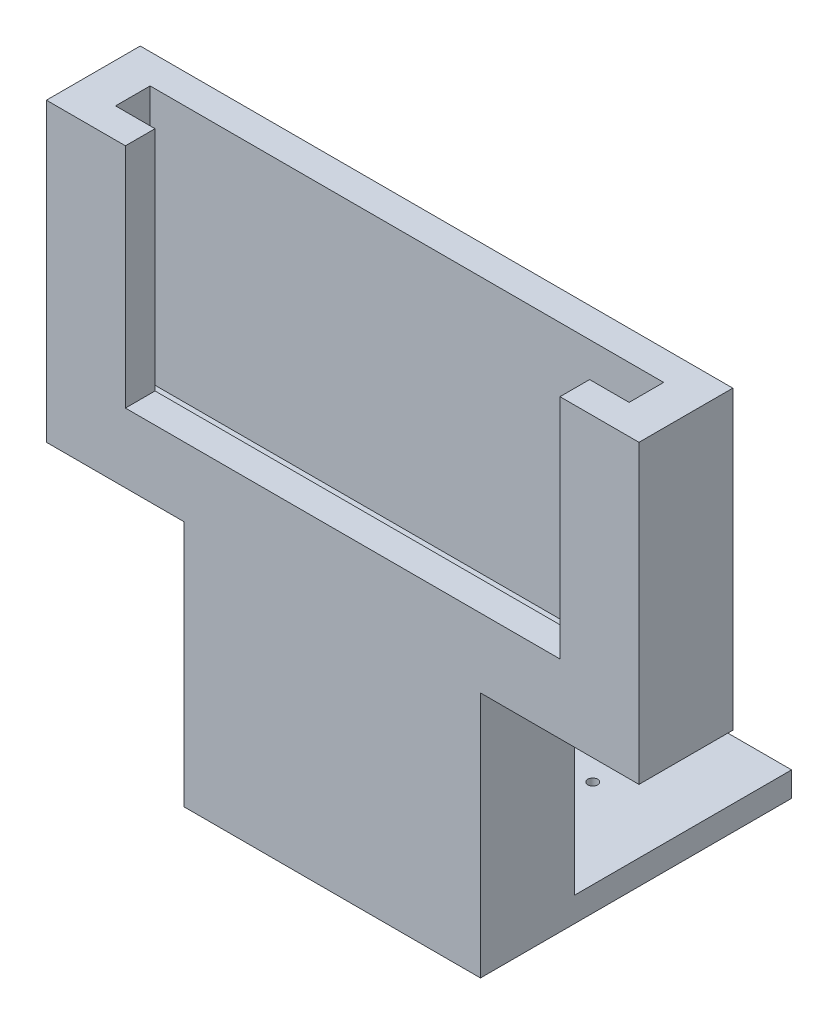
ISO-10303-21;
HEADER;
FILE_DESCRIPTION(('STEP AP214'),'2;1');
FILE_NAME('part.step','',(''),(''),'','','');
FILE_SCHEMA(('AUTOMOTIVE_DESIGN { 1 0 10303 214 1 1 1 1 }'));
ENDSEC;
DATA;
#1=APPLICATION_CONTEXT('core data for automotive mechanical design processes');
#2=APPLICATION_PROTOCOL_DEFINITION('international standard','automotive_design',2000,#1);
#3=PRODUCT_CONTEXT('',#1,'mechanical');
#4=PRODUCT('Part','Part','',(#3));
#5=PRODUCT_RELATED_PRODUCT_CATEGORY('part','',(#4));
#6=PRODUCT_DEFINITION_FORMATION('','',#4);
#7=PRODUCT_DEFINITION_CONTEXT('part definition',#1,'design');
#8=PRODUCT_DEFINITION('design','',#6,#7);
#9=PRODUCT_DEFINITION_SHAPE('','',#8);
#10=(LENGTH_UNIT() NAMED_UNIT(*) SI_UNIT(.MILLI.,.METRE.));
#11=(NAMED_UNIT(*) PLANE_ANGLE_UNIT() SI_UNIT($,.RADIAN.));
#12=(NAMED_UNIT(*) SI_UNIT($,.STERADIAN.) SOLID_ANGLE_UNIT());
#13=UNCERTAINTY_MEASURE_WITH_UNIT(LENGTH_MEASURE(1.E-05),#10,'distance_accuracy_value','');
#14=(GEOMETRIC_REPRESENTATION_CONTEXT(3) GLOBAL_UNCERTAINTY_ASSIGNED_CONTEXT((#13)) GLOBAL_UNIT_ASSIGNED_CONTEXT((#10,
#11,#12)) REPRESENTATION_CONTEXT('',''));
#15=CARTESIAN_POINT('',(0.,0.,0.));
#16=DIRECTION('',(0.,0.,1.));
#17=DIRECTION('',(1.,0.,0.));
#18=AXIS2_PLACEMENT_3D('',#15,#16,#17);
#19=CARTESIAN_POINT('',(0.,0.,0.));
#20=DIRECTION('',(0.,0.,1.));
#21=DIRECTION('',(1.,0.,0.));
#22=AXIS2_PLACEMENT_3D('',#19,#20,#21);
#23=PLANE('',#22);
#24=DIRECTION('',(1.,0.,0.));
#25=VECTOR('',#24,1.);
#26=CARTESIAN_POINT('',(13.951048951049,-37.5,0.));
#27=LINE('',#26,#25);
#28=CARTESIAN_POINT('',(-16.048951048951,-37.5,0.));
#29=VERTEX_POINT('',#28);
#30=CARTESIAN_POINT('',(13.951048951049,-37.5,0.));
#31=VERTEX_POINT('',#30);
#32=EDGE_CURVE('E178',#29,#31,#27,.T.);
#33=ORIENTED_EDGE('',*,*,#32,.F.);
#34=DIRECTION('',(0.,1.,0.));
#35=VECTOR('',#34,1.);
#36=CARTESIAN_POINT('',(-16.048951048951,0.,0.));
#37=LINE('',#36,#35);
#38=CARTESIAN_POINT('',(-16.048951048951,-15.,0.));
#39=VERTEX_POINT('',#38);
#40=EDGE_CURVE('E416',#29,#39,#37,.T.);
#41=ORIENTED_EDGE('',*,*,#40,.T.);
#42=DIRECTION('',(-1.,0.,0.));
#43=VECTOR('',#42,1.);
#44=CARTESIAN_POINT('',(0.,-15.,0.));
#45=LINE('',#44,#43);
#46=CARTESIAN_POINT('',(-30.,-15.,0.));
#47=VERTEX_POINT('',#46);
#48=EDGE_CURVE('E413',#39,#47,#45,.T.);
#49=ORIENTED_EDGE('',*,*,#48,.T.);
#50=DIRECTION('',(0.,1.,0.));
#51=VECTOR('',#50,1.);
#52=CARTESIAN_POINT('',(-30.,0.,0.));
#53=LINE('',#52,#51);
#54=CARTESIAN_POINT('',(-30.,15.,0.));
#55=VERTEX_POINT('',#54);
#56=EDGE_CURVE('E398',#47,#55,#53,.T.);
#57=ORIENTED_EDGE('',*,*,#56,.T.);
#58=DIRECTION('',(-1.,0.,0.));
#59=VECTOR('',#58,1.);
#60=CARTESIAN_POINT('',(0.,15.,0.));
#61=LINE('',#60,#59);
#62=CARTESIAN_POINT('',(30.,15.,0.));
#63=VERTEX_POINT('',#62);
#64=EDGE_CURVE('E410',#63,#55,#61,.T.);
#65=ORIENTED_EDGE('',*,*,#64,.F.);
#66=DIRECTION('',(0.,1.,0.));
#67=VECTOR('',#66,1.);
#68=CARTESIAN_POINT('',(30.,0.,0.));
#69=LINE('',#68,#67);
#70=CARTESIAN_POINT('',(30.,-15.,0.));
#71=VERTEX_POINT('',#70);
#72=EDGE_CURVE('E421',#71,#63,#69,.T.);
#73=ORIENTED_EDGE('',*,*,#72,.F.);
#74=CARTESIAN_POINT('',(13.951048951049,-15.,0.));
#75=VERTEX_POINT('',#74);
#76=EDGE_CURVE('E417',#71,#75,#45,.T.);
#77=ORIENTED_EDGE('',*,*,#76,.T.);
#78=DIRECTION('',(0.,1.,0.));
#79=VECTOR('',#78,1.);
#80=CARTESIAN_POINT('',(13.951048951049,0.,0.));
#81=LINE('',#80,#79);
#82=EDGE_CURVE('E419',#31,#75,#81,.T.);
#83=ORIENTED_EDGE('',*,*,#82,.F.);
#84=EDGE_LOOP('',(#33,#41,#49,#57,#65,#73,#77,#83));
#85=FACE_BOUND('',#84,.T.);
#86=ADVANCED_FACE('F161',(#85),#23,.F.);
#87=CARTESIAN_POINT('',(0.,0.,3.));
#88=DIRECTION('',(0.,0.,1.));
#89=DIRECTION('',(1.,0.,0.));
#90=AXIS2_PLACEMENT_3D('',#87,#88,#89);
#91=PLANE('',#90);
#92=DIRECTION('',(-1.,0.,0.));
#93=VECTOR('',#92,1.);
#94=CARTESIAN_POINT('',(0.,15.,3.));
#95=LINE('',#94,#93);
#96=CARTESIAN_POINT('',(26.,15.,3.));
#97=VERTEX_POINT('',#96);
#98=CARTESIAN_POINT('',(-26.,15.,3.));
#99=VERTEX_POINT('',#98);
#100=EDGE_CURVE('E407',#97,#99,#95,.T.);
#101=ORIENTED_EDGE('',*,*,#100,.T.);
#102=DIRECTION('',(0.,-1.,0.));
#103=VECTOR('',#102,1.);
#104=CARTESIAN_POINT('',(-26.,15.,3.));
#105=LINE('',#104,#103);
#106=CARTESIAN_POINT('',(-26.,-11.,3.));
#107=VERTEX_POINT('',#106);
#108=EDGE_CURVE('E186',#99,#107,#105,.T.);
#109=ORIENTED_EDGE('',*,*,#108,.T.);
#110=DIRECTION('',(1.,0.,0.));
#111=VECTOR('',#110,1.);
#112=CARTESIAN_POINT('',(-26.,-11.,3.));
#113=LINE('',#112,#111);
#114=CARTESIAN_POINT('',(26.,-11.,3.));
#115=VERTEX_POINT('',#114);
#116=EDGE_CURVE('E394',#107,#115,#113,.T.);
#117=ORIENTED_EDGE('',*,*,#116,.T.);
#118=DIRECTION('',(0.,-1.,0.));
#119=VECTOR('',#118,1.);
#120=CARTESIAN_POINT('',(26.,15.,3.));
#121=LINE('',#120,#119);
#122=EDGE_CURVE('E360',#97,#115,#121,.T.);
#123=ORIENTED_EDGE('',*,*,#122,.F.);
#124=EDGE_LOOP('',(#101,#109,#117,#123));
#125=FACE_BOUND('',#124,.T.);
#126=ADVANCED_FACE('F485',(#125),#91,.T.);
#127=CARTESIAN_POINT('',(-30.,0.,3.));
#128=DIRECTION('',(-1.,0.,0.));
#129=DIRECTION('',(0.,0.,1.));
#130=AXIS2_PLACEMENT_3D('',#127,#128,#129);
#131=PLANE('',#130);
#132=ORIENTED_EDGE('',*,*,#56,.F.);
#133=DIRECTION('',(0.,0.,-1.));
#134=VECTOR('',#133,1.);
#135=CARTESIAN_POINT('',(-30.,-15.,3.));
#136=LINE('',#135,#134);
#137=CARTESIAN_POINT('',(-30.,-15.,9.5));
#138=VERTEX_POINT('',#137);
#139=EDGE_CURVE('E12',#138,#47,#136,.T.);
#140=ORIENTED_EDGE('',*,*,#139,.F.);
#141=DIRECTION('',(0.,-1.,0.));
#142=VECTOR('',#141,1.);
#143=CARTESIAN_POINT('',(-30.,15.,9.5));
#144=LINE('',#143,#142);
#145=CARTESIAN_POINT('',(-30.,15.,9.5));
#146=VERTEX_POINT('',#145);
#147=EDGE_CURVE('E337',#146,#138,#144,.T.);
#148=ORIENTED_EDGE('',*,*,#147,.F.);
#149=DIRECTION('',(0.,0.,-1.));
#150=VECTOR('',#149,1.);
#151=CARTESIAN_POINT('',(-30.,15.,3.));
#152=LINE('',#151,#150);
#153=EDGE_CURVE('E409',#146,#55,#152,.T.);
#154=ORIENTED_EDGE('',*,*,#153,.T.);
#155=EDGE_LOOP('',(#132,#140,#148,#154));
#156=FACE_BOUND('',#155,.T.);
#157=ADVANCED_FACE('F163',(#156),#131,.T.);
#158=CARTESIAN_POINT('',(0.,-15.,3.));
#159=DIRECTION('',(0.,-1.,0.));
#160=DIRECTION('',(1.,0.,0.));
#161=AXIS2_PLACEMENT_3D('',#158,#159,#160);
#162=PLANE('',#161);
#163=ORIENTED_EDGE('',*,*,#48,.F.);
#164=DIRECTION('',(0.,0.,-1.));
#165=VECTOR('',#164,1.);
#166=CARTESIAN_POINT('',(-16.048951048951,-15.,3.));
#167=LINE('',#166,#165);
#168=CARTESIAN_POINT('',(-16.048951048951,-15.,9.5));
#169=VERTEX_POINT('',#168);
#170=EDGE_CURVE('E170',#169,#39,#167,.T.);
#171=ORIENTED_EDGE('',*,*,#170,.F.);
#172=DIRECTION('',(1.,0.,0.));
#173=VECTOR('',#172,1.);
#174=CARTESIAN_POINT('',(-30.,-15.,9.5));
#175=LINE('',#174,#173);
#176=EDGE_CURVE('E327',#138,#169,#175,.T.);
#177=ORIENTED_EDGE('',*,*,#176,.F.);
#178=ORIENTED_EDGE('',*,*,#139,.T.);
#179=EDGE_LOOP('',(#163,#171,#177,#178));
#180=FACE_BOUND('',#179,.T.);
#181=ADVANCED_FACE('F480',(#180),#162,.T.);
#182=CARTESIAN_POINT('',(-16.048951048951,0.,3.));
#183=DIRECTION('',(-1.,0.,0.));
#184=DIRECTION('',(0.,0.,1.));
#185=AXIS2_PLACEMENT_3D('',#182,#183,#184);
#186=PLANE('',#185);
#187=ORIENTED_EDGE('',*,*,#40,.F.);
#188=DIRECTION('',(0.,0.,1.));
#189=VECTOR('',#188,1.);
#190=CARTESIAN_POINT('',(-16.048951048951,-37.5,-22.));
#191=LINE('',#190,#189);
#192=CARTESIAN_POINT('',(-16.048951048951,-37.5,-22.));
#193=VERTEX_POINT('',#192);
#194=EDGE_CURVE('E323',#193,#29,#191,.T.);
#195=ORIENTED_EDGE('',*,*,#194,.F.);
#196=DIRECTION('',(0.,1.,0.));
#197=VECTOR('',#196,1.);
#198=CARTESIAN_POINT('',(-16.048951048951,-40.,-22.));
#199=LINE('',#198,#197);
#200=CARTESIAN_POINT('',(-16.048951048951,-40.,-22.));
#201=VERTEX_POINT('',#200);
#202=EDGE_CURVE('E306',#201,#193,#199,.T.);
#203=ORIENTED_EDGE('',*,*,#202,.F.);
#204=DIRECTION('',(0.,0.,-1.));
#205=VECTOR('',#204,1.);
#206=CARTESIAN_POINT('',(-16.048951048951,-40.,3.));
#207=LINE('',#206,#205);
#208=CARTESIAN_POINT('',(-16.048951048951,-40.,9.5));
#209=VERTEX_POINT('',#208);
#210=EDGE_CURVE('E298',#209,#201,#207,.T.);
#211=ORIENTED_EDGE('',*,*,#210,.F.);
#212=DIRECTION('',(0.,-1.,0.));
#213=VECTOR('',#212,1.);
#214=CARTESIAN_POINT('',(-16.048951048951,-15.,9.5));
#215=LINE('',#214,#213);
#216=EDGE_CURVE('E373',#169,#209,#215,.T.);
#217=ORIENTED_EDGE('',*,*,#216,.F.);
#218=ORIENTED_EDGE('',*,*,#170,.T.);
#219=EDGE_LOOP('',(#187,#195,#203,#211,#217,#218));
#220=FACE_BOUND('',#219,.T.);
#221=ADVANCED_FACE('F469',(#220),#186,.T.);
#222=CARTESIAN_POINT('',(0.,-40.,3.));
#223=DIRECTION('',(0.,-1.,0.));
#224=DIRECTION('',(1.,0.,0.));
#225=AXIS2_PLACEMENT_3D('',#222,#223,#224);
#226=PLANE('',#225);
#227=CARTESIAN_POINT('',(-1.04895104895104,-40.,-4.86835964971758));
#228=DIRECTION('',(0.,-1.,0.));
#229=DIRECTION('',(1.,0.,0.));
#230=AXIS2_PLACEMENT_3D('',#227,#228,#229);
#231=CIRCLE('',#230,0.5);
#232=CARTESIAN_POINT('',(-0.54895104895104,-40.,-4.86835964971758));
#233=VERTEX_POINT('',#232);
#234=EDGE_CURVE('E444',#233,#233,#231,.T.);
#235=ORIENTED_EDGE('',*,*,#234,.F.);
#236=EDGE_LOOP('',(#235));
#237=FACE_BOUND('',#236,.T.);
#238=CARTESIAN_POINT('',(-1.04895104895104,-40.,-16.8683596497176));
#239=DIRECTION('',(0.,-1.,0.));
#240=DIRECTION('',(1.,0.,0.));
#241=AXIS2_PLACEMENT_3D('',#238,#239,#240);
#242=CIRCLE('',#241,0.5);
#243=CARTESIAN_POINT('',(-0.548951048951039,-40.,-16.8683596497176));
#244=VERTEX_POINT('',#243);
#245=EDGE_CURVE('E708',#244,#244,#242,.T.);
#246=ORIENTED_EDGE('',*,*,#245,.F.);
#247=EDGE_LOOP('',(#246));
#248=FACE_BOUND('',#247,.T.);
#249=CARTESIAN_POINT('',(4.95104895104896,-40.,-10.8683596497176));
#250=DIRECTION('',(0.,-1.,0.));
#251=DIRECTION('',(1.,0.,0.));
#252=AXIS2_PLACEMENT_3D('',#249,#250,#251);
#253=CIRCLE('',#252,0.500000000000001);
#254=CARTESIAN_POINT('',(5.45104895104896,-40.,-10.8683596497176));
#255=VERTEX_POINT('',#254);
#256=EDGE_CURVE('E711',#255,#255,#253,.T.);
#257=ORIENTED_EDGE('',*,*,#256,.F.);
#258=EDGE_LOOP('',(#257));
#259=FACE_BOUND('',#258,.T.);
#260=CARTESIAN_POINT('',(-7.04895104895104,-40.,-10.8683596497176));
#261=DIRECTION('',(0.,-1.,0.));
#262=DIRECTION('',(1.,0.,0.));
#263=AXIS2_PLACEMENT_3D('',#260,#261,#262);
#264=CIRCLE('',#263,0.500000000000001);
#265=CARTESIAN_POINT('',(-6.54895104895104,-40.,-10.8683596497176));
#266=VERTEX_POINT('',#265);
#267=EDGE_CURVE('E458',#266,#266,#264,.T.);
#268=ORIENTED_EDGE('',*,*,#267,.F.);
#269=EDGE_LOOP('',(#268));
#270=FACE_BOUND('',#269,.T.);
#271=CARTESIAN_POINT('',(-1.04895104895104,-40.,-10.8683596497176));
#272=DIRECTION('',(0.,-1.,0.));
#273=DIRECTION('',(1.,0.,0.));
#274=AXIS2_PLACEMENT_3D('',#271,#272,#273);
#275=CIRCLE('',#274,3.);
#276=CARTESIAN_POINT('',(1.95104895104896,-40.,-10.8683596497176));
#277=VERTEX_POINT('',#276);
#278=EDGE_CURVE('E316',#277,#277,#275,.T.);
#279=ORIENTED_EDGE('',*,*,#278,.F.);
#280=EDGE_LOOP('',(#279));
#281=FACE_BOUND('',#280,.T.);
#282=ORIENTED_EDGE('',*,*,#210,.T.);
#283=DIRECTION('',(-1.,0.,0.));
#284=VECTOR('',#283,1.);
#285=CARTESIAN_POINT('',(13.951048951049,-40.,-22.));
#286=LINE('',#285,#284);
#287=CARTESIAN_POINT('',(13.951048951049,-40.,-22.));
#288=VERTEX_POINT('',#287);
#289=EDGE_CURVE('E302',#288,#201,#286,.T.);
#290=ORIENTED_EDGE('',*,*,#289,.F.);
#291=DIRECTION('',(0.,0.,-1.));
#292=VECTOR('',#291,1.);
#293=CARTESIAN_POINT('',(13.951048951049,-40.,3.));
#294=LINE('',#293,#292);
#295=CARTESIAN_POINT('',(13.951048951049,-40.,9.5));
#296=VERTEX_POINT('',#295);
#297=EDGE_CURVE('E287',#296,#288,#294,.T.);
#298=ORIENTED_EDGE('',*,*,#297,.F.);
#299=DIRECTION('',(1.,0.,0.));
#300=VECTOR('',#299,1.);
#301=CARTESIAN_POINT('',(-16.048951048951,-40.,9.5));
#302=LINE('',#301,#300);
#303=EDGE_CURVE('E326',#209,#296,#302,.T.);
#304=ORIENTED_EDGE('',*,*,#303,.F.);
#305=EDGE_LOOP('',(#282,#290,#298,#304));
#306=FACE_BOUND('',#305,.T.);
#307=ADVANCED_FACE('F303',(#237,#248,#259,#270,#281,#306),#226,.T.);
#308=CARTESIAN_POINT('',(13.951048951049,0.,3.));
#309=DIRECTION('',(-1.,0.,0.));
#310=DIRECTION('',(0.,-1.,0.));
#311=AXIS2_PLACEMENT_3D('',#308,#309,#310);
#312=PLANE('',#311);
#313=ORIENTED_EDGE('',*,*,#297,.T.);
#314=DIRECTION('',(0.,-1.,0.));
#315=VECTOR('',#314,1.);
#316=CARTESIAN_POINT('',(13.951048951049,-40.,-22.));
#317=LINE('',#316,#315);
#318=CARTESIAN_POINT('',(13.951048951049,-37.5,-22.));
#319=VERTEX_POINT('',#318);
#320=EDGE_CURVE('E292',#319,#288,#317,.T.);
#321=ORIENTED_EDGE('',*,*,#320,.F.);
#322=DIRECTION('',(0.,0.,1.));
#323=VECTOR('',#322,1.);
#324=CARTESIAN_POINT('',(13.951048951049,-37.5,-22.));
#325=LINE('',#324,#323);
#326=EDGE_CURVE('E320',#319,#31,#325,.T.);
#327=ORIENTED_EDGE('',*,*,#326,.T.);
#328=ORIENTED_EDGE('',*,*,#82,.T.);
#329=DIRECTION('',(0.,0.,-1.));
#330=VECTOR('',#329,1.);
#331=CARTESIAN_POINT('',(13.951048951049,-15.,3.));
#332=LINE('',#331,#330);
#333=CARTESIAN_POINT('',(13.951048951049,-15.,9.5));
#334=VERTEX_POINT('',#333);
#335=EDGE_CURVE('E299',#334,#75,#332,.T.);
#336=ORIENTED_EDGE('',*,*,#335,.F.);
#337=DIRECTION('',(0.,-1.,0.));
#338=VECTOR('',#337,1.);
#339=CARTESIAN_POINT('',(13.951048951049,-15.,9.5));
#340=LINE('',#339,#338);
#341=EDGE_CURVE('E294',#334,#296,#340,.T.);
#342=ORIENTED_EDGE('',*,*,#341,.T.);
#343=EDGE_LOOP('',(#313,#321,#327,#328,#336,#342));
#344=FACE_BOUND('',#343,.T.);
#345=ADVANCED_FACE('F289',(#344),#312,.F.);
#346=ORIENTED_EDGE('',*,*,#76,.F.);
#347=DIRECTION('',(0.,0.,-1.));
#348=VECTOR('',#347,1.);
#349=CARTESIAN_POINT('',(30.,-15.,3.));
#350=LINE('',#349,#348);
#351=CARTESIAN_POINT('',(30.,-15.,9.5));
#352=VERTEX_POINT('',#351);
#353=EDGE_CURVE('E429',#352,#71,#350,.T.);
#354=ORIENTED_EDGE('',*,*,#353,.F.);
#355=DIRECTION('',(1.,0.,0.));
#356=VECTOR('',#355,1.);
#357=CARTESIAN_POINT('',(-22.,-15.,9.5));
#358=LINE('',#357,#356);
#359=EDGE_CURVE('E352',#334,#352,#358,.T.);
#360=ORIENTED_EDGE('',*,*,#359,.F.);
#361=ORIENTED_EDGE('',*,*,#335,.T.);
#362=EDGE_LOOP('',(#346,#354,#360,#361));
#363=FACE_BOUND('',#362,.T.);
#364=ADVANCED_FACE('F477',(#363),#162,.T.);
#365=CARTESIAN_POINT('',(30.,0.,3.));
#366=DIRECTION('',(-1.,0.,0.));
#367=DIRECTION('',(0.,0.,1.));
#368=AXIS2_PLACEMENT_3D('',#365,#366,#367);
#369=PLANE('',#368);
#370=ORIENTED_EDGE('',*,*,#72,.T.);
#371=DIRECTION('',(0.,0.,-1.));
#372=VECTOR('',#371,1.);
#373=CARTESIAN_POINT('',(30.,15.,3.));
#374=LINE('',#373,#372);
#375=CARTESIAN_POINT('',(30.,15.,9.5));
#376=VERTEX_POINT('',#375);
#377=EDGE_CURVE('E426',#376,#63,#374,.T.);
#378=ORIENTED_EDGE('',*,*,#377,.F.);
#379=DIRECTION('',(0.,1.,0.));
#380=VECTOR('',#379,1.);
#381=CARTESIAN_POINT('',(30.,-15.,9.5));
#382=LINE('',#381,#380);
#383=EDGE_CURVE('E368',#352,#376,#382,.T.);
#384=ORIENTED_EDGE('',*,*,#383,.F.);
#385=ORIENTED_EDGE('',*,*,#353,.T.);
#386=EDGE_LOOP('',(#370,#378,#384,#385));
#387=FACE_BOUND('',#386,.T.);
#388=ADVANCED_FACE('F498',(#387),#369,.F.);
#389=CARTESIAN_POINT('',(0.,15.,3.));
#390=DIRECTION('',(0.,-1.,0.));
#391=DIRECTION('',(1.,0.,0.));
#392=AXIS2_PLACEMENT_3D('',#389,#390,#391);
#393=PLANE('',#392);
#394=ORIENTED_EDGE('',*,*,#64,.T.);
#395=ORIENTED_EDGE('',*,*,#153,.F.);
#396=DIRECTION('',(1.,0.,0.));
#397=VECTOR('',#396,1.);
#398=CARTESIAN_POINT('',(-30.,15.,9.5));
#399=LINE('',#398,#397);
#400=CARTESIAN_POINT('',(-22.,15.,9.5));
#401=VERTEX_POINT('',#400);
#402=EDGE_CURVE('E334',#146,#401,#399,.T.);
#403=ORIENTED_EDGE('',*,*,#402,.T.);
#404=DIRECTION('',(0.,0.,-1.));
#405=VECTOR('',#404,1.);
#406=CARTESIAN_POINT('',(-22.,15.,9.5));
#407=LINE('',#406,#405);
#408=CARTESIAN_POINT('',(-22.,15.,6.5));
#409=VERTEX_POINT('',#408);
#410=EDGE_CURVE('E340',#401,#409,#407,.T.);
#411=ORIENTED_EDGE('',*,*,#410,.T.);
#412=DIRECTION('',(1.,0.,0.));
#413=VECTOR('',#412,1.);
#414=CARTESIAN_POINT('',(-30.,15.,6.5));
#415=LINE('',#414,#413);
#416=CARTESIAN_POINT('',(-26.,15.,6.5));
#417=VERTEX_POINT('',#416);
#418=EDGE_CURVE('E331',#417,#409,#415,.T.);
#419=ORIENTED_EDGE('',*,*,#418,.F.);
#420=DIRECTION('',(0.,0.,-1.));
#421=VECTOR('',#420,1.);
#422=CARTESIAN_POINT('',(-26.,15.,6.5));
#423=LINE('',#422,#421);
#424=EDGE_CURVE('E385',#417,#99,#423,.T.);
#425=ORIENTED_EDGE('',*,*,#424,.T.);
#426=ORIENTED_EDGE('',*,*,#100,.F.);
#427=DIRECTION('',(0.,0.,-1.));
#428=VECTOR('',#427,1.);
#429=CARTESIAN_POINT('',(26.,15.,6.5));
#430=LINE('',#429,#428);
#431=CARTESIAN_POINT('',(26.,15.,6.5));
#432=VERTEX_POINT('',#431);
#433=EDGE_CURVE('E396',#432,#97,#430,.T.);
#434=ORIENTED_EDGE('',*,*,#433,.F.);
#435=DIRECTION('',(-1.,0.,0.));
#436=VECTOR('',#435,1.);
#437=CARTESIAN_POINT('',(30.,15.,6.5));
#438=LINE('',#437,#436);
#439=CARTESIAN_POINT('',(22.,15.,6.5));
#440=VERTEX_POINT('',#439);
#441=EDGE_CURVE('E371',#432,#440,#438,.T.);
#442=ORIENTED_EDGE('',*,*,#441,.T.);
#443=DIRECTION('',(0.,0.,-1.));
#444=VECTOR('',#443,1.);
#445=CARTESIAN_POINT('',(22.,15.,9.5));
#446=LINE('',#445,#444);
#447=CARTESIAN_POINT('',(22.,15.,9.5));
#448=VERTEX_POINT('',#447);
#449=EDGE_CURVE('E358',#448,#440,#446,.T.);
#450=ORIENTED_EDGE('',*,*,#449,.F.);
#451=DIRECTION('',(-1.,0.,0.));
#452=VECTOR('',#451,1.);
#453=CARTESIAN_POINT('',(30.,15.,9.5));
#454=LINE('',#453,#452);
#455=EDGE_CURVE('E362',#376,#448,#454,.T.);
#456=ORIENTED_EDGE('',*,*,#455,.F.);
#457=ORIENTED_EDGE('',*,*,#377,.T.);
#458=EDGE_LOOP('',(#394,#395,#403,#411,#419,#425,#426,#434,#442,#450,#456,#457));
#459=FACE_BOUND('',#458,.T.);
#460=ADVANCED_FACE('F494',(#459),#393,.F.);
#461=CARTESIAN_POINT('',(-26.,15.,6.5));
#462=DIRECTION('',(1.,0.,0.));
#463=DIRECTION('',(0.,0.,-1.));
#464=AXIS2_PLACEMENT_3D('',#461,#462,#463);
#465=PLANE('',#464);
#466=DIRECTION('',(0.,-1.,0.));
#467=VECTOR('',#466,1.);
#468=CARTESIAN_POINT('',(-26.,15.,6.5));
#469=LINE('',#468,#467);
#470=CARTESIAN_POINT('',(-26.,-11.,6.5));
#471=VERTEX_POINT('',#470);
#472=EDGE_CURVE('E382',#417,#471,#469,.T.);
#473=ORIENTED_EDGE('',*,*,#472,.T.);
#474=DIRECTION('',(0.,0.,-1.));
#475=VECTOR('',#474,1.);
#476=CARTESIAN_POINT('',(-26.,-11.,6.5));
#477=LINE('',#476,#475);
#478=EDGE_CURVE('E390',#471,#107,#477,.T.);
#479=ORIENTED_EDGE('',*,*,#478,.T.);
#480=ORIENTED_EDGE('',*,*,#108,.F.);
#481=ORIENTED_EDGE('',*,*,#424,.F.);
#482=EDGE_LOOP('',(#473,#479,#480,#481));
#483=FACE_BOUND('',#482,.T.);
#484=ADVANCED_FACE('F497',(#483),#465,.T.);
#485=CARTESIAN_POINT('',(26.,15.,6.5));
#486=DIRECTION('',(1.,0.,0.));
#487=DIRECTION('',(0.,1.,0.));
#488=AXIS2_PLACEMENT_3D('',#485,#486,#487);
#489=PLANE('',#488);
#490=DIRECTION('',(0.,0.,-1.));
#491=VECTOR('',#490,1.);
#492=CARTESIAN_POINT('',(26.,-11.,6.5));
#493=LINE('',#492,#491);
#494=CARTESIAN_POINT('',(26.,-11.,6.5));
#495=VERTEX_POINT('',#494);
#496=EDGE_CURVE('E387',#495,#115,#493,.T.);
#497=ORIENTED_EDGE('',*,*,#496,.F.);
#498=DIRECTION('',(0.,-1.,0.));
#499=VECTOR('',#498,1.);
#500=CARTESIAN_POINT('',(26.,15.,6.5));
#501=LINE('',#500,#499);
#502=EDGE_CURVE('E401',#432,#495,#501,.T.);
#503=ORIENTED_EDGE('',*,*,#502,.F.);
#504=ORIENTED_EDGE('',*,*,#433,.T.);
#505=ORIENTED_EDGE('',*,*,#122,.T.);
#506=EDGE_LOOP('',(#497,#503,#504,#505));
#507=FACE_BOUND('',#506,.T.);
#508=ADVANCED_FACE('F555',(#507),#489,.F.);
#509=CARTESIAN_POINT('',(-26.,-11.,6.5));
#510=DIRECTION('',(0.,1.,0.));
#511=DIRECTION('',(0.,0.,1.));
#512=AXIS2_PLACEMENT_3D('',#509,#510,#511);
#513=PLANE('',#512);
#514=ORIENTED_EDGE('',*,*,#116,.F.);
#515=ORIENTED_EDGE('',*,*,#478,.F.);
#516=DIRECTION('',(1.,0.,0.));
#517=VECTOR('',#516,1.);
#518=CARTESIAN_POINT('',(-26.,-11.,6.5));
#519=LINE('',#518,#517);
#520=EDGE_CURVE('E391',#471,#495,#519,.T.);
#521=ORIENTED_EDGE('',*,*,#520,.T.);
#522=ORIENTED_EDGE('',*,*,#496,.T.);
#523=EDGE_LOOP('',(#514,#515,#521,#522));
#524=FACE_BOUND('',#523,.T.);
#525=ADVANCED_FACE('F551',(#524),#513,.T.);
#526=CARTESIAN_POINT('',(0.,0.,6.5));
#527=DIRECTION('',(0.,0.,-1.));
#528=DIRECTION('',(-1.,0.,0.));
#529=AXIS2_PLACEMENT_3D('',#526,#527,#528);
#530=PLANE('',#529);
#531=ORIENTED_EDGE('',*,*,#441,.F.);
#532=ORIENTED_EDGE('',*,*,#502,.T.);
#533=ORIENTED_EDGE('',*,*,#520,.F.);
#534=ORIENTED_EDGE('',*,*,#472,.F.);
#535=ORIENTED_EDGE('',*,*,#418,.T.);
#536=DIRECTION('',(0.,-1.,0.));
#537=VECTOR('',#536,1.);
#538=CARTESIAN_POINT('',(-22.,15.,6.5));
#539=LINE('',#538,#537);
#540=CARTESIAN_POINT('',(-22.,-8.00000000000001,6.5));
#541=VERTEX_POINT('',#540);
#542=EDGE_CURVE('E341',#409,#541,#539,.T.);
#543=ORIENTED_EDGE('',*,*,#542,.T.);
#544=DIRECTION('',(1.,0.,0.));
#545=VECTOR('',#544,1.);
#546=CARTESIAN_POINT('',(-22.,-8.00000000000001,6.5));
#547=LINE('',#546,#545);
#548=CARTESIAN_POINT('',(22.,-8.00000000000001,6.5));
#549=VERTEX_POINT('',#548);
#550=EDGE_CURVE('E353',#541,#549,#547,.T.);
#551=ORIENTED_EDGE('',*,*,#550,.T.);
#552=DIRECTION('',(0.,1.,0.));
#553=VECTOR('',#552,1.);
#554=CARTESIAN_POINT('',(22.,-15.,6.5));
#555=LINE('',#554,#553);
#556=EDGE_CURVE('E366',#549,#440,#555,.T.);
#557=ORIENTED_EDGE('',*,*,#556,.T.);
#558=EDGE_LOOP('',(#531,#532,#533,#534,#535,#543,#551,#557));
#559=FACE_BOUND('',#558,.T.);
#560=ADVANCED_FACE('F556',(#559),#530,.T.);
#561=CARTESIAN_POINT('',(0.,0.,9.5));
#562=DIRECTION('',(0.,0.,-1.));
#563=DIRECTION('',(-1.,0.,0.));
#564=AXIS2_PLACEMENT_3D('',#561,#562,#563);
#565=PLANE('',#564);
#566=ORIENTED_EDGE('',*,*,#176,.T.);
#567=ORIENTED_EDGE('',*,*,#216,.T.);
#568=ORIENTED_EDGE('',*,*,#303,.T.);
#569=ORIENTED_EDGE('',*,*,#341,.F.);
#570=ORIENTED_EDGE('',*,*,#359,.T.);
#571=ORIENTED_EDGE('',*,*,#383,.T.);
#572=ORIENTED_EDGE('',*,*,#455,.T.);
#573=DIRECTION('',(0.,1.,0.));
#574=VECTOR('',#573,1.);
#575=CARTESIAN_POINT('',(22.,-15.,9.5));
#576=LINE('',#575,#574);
#577=CARTESIAN_POINT('',(22.,-8.00000000000001,9.5));
#578=VERTEX_POINT('',#577);
#579=EDGE_CURVE('E365',#578,#448,#576,.T.);
#580=ORIENTED_EDGE('',*,*,#579,.F.);
#581=DIRECTION('',(1.,0.,0.));
#582=VECTOR('',#581,1.);
#583=CARTESIAN_POINT('',(-22.,-8.00000000000001,9.5));
#584=LINE('',#583,#582);
#585=CARTESIAN_POINT('',(-22.,-8.00000000000001,9.5));
#586=VERTEX_POINT('',#585);
#587=EDGE_CURVE('E349',#586,#578,#584,.T.);
#588=ORIENTED_EDGE('',*,*,#587,.F.);
#589=DIRECTION('',(0.,-1.,0.));
#590=VECTOR('',#589,1.);
#591=CARTESIAN_POINT('',(-22.,15.,9.5));
#592=LINE('',#591,#590);
#593=EDGE_CURVE('E330',#401,#586,#592,.T.);
#594=ORIENTED_EDGE('',*,*,#593,.F.);
#595=ORIENTED_EDGE('',*,*,#402,.F.);
#596=ORIENTED_EDGE('',*,*,#147,.T.);
#597=EDGE_LOOP('',(#566,#567,#568,#569,#570,#571,#572,#580,#588,#594,#595,#596));
#598=FACE_BOUND('',#597,.T.);
#599=ADVANCED_FACE('F521',(#598),#565,.F.);
#600=CARTESIAN_POINT('',(-22.,15.,9.5));
#601=DIRECTION('',(1.,0.,0.));
#602=DIRECTION('',(0.,1.,0.));
#603=AXIS2_PLACEMENT_3D('',#600,#601,#602);
#604=PLANE('',#603);
#605=ORIENTED_EDGE('',*,*,#593,.T.);
#606=DIRECTION('',(0.,0.,-1.));
#607=VECTOR('',#606,1.);
#608=CARTESIAN_POINT('',(-22.,-8.00000000000001,9.5));
#609=LINE('',#608,#607);
#610=EDGE_CURVE('E348',#586,#541,#609,.T.);
#611=ORIENTED_EDGE('',*,*,#610,.T.);
#612=ORIENTED_EDGE('',*,*,#542,.F.);
#613=ORIENTED_EDGE('',*,*,#410,.F.);
#614=EDGE_LOOP('',(#605,#611,#612,#613));
#615=FACE_BOUND('',#614,.T.);
#616=ADVANCED_FACE('F542',(#615),#604,.T.);
#617=CARTESIAN_POINT('',(22.,-15.,9.5));
#618=DIRECTION('',(-1.,0.,0.));
#619=DIRECTION('',(0.,0.,1.));
#620=AXIS2_PLACEMENT_3D('',#617,#618,#619);
#621=PLANE('',#620);
#622=DIRECTION('',(0.,0.,-1.));
#623=VECTOR('',#622,1.);
#624=CARTESIAN_POINT('',(22.,-8.00000000000001,9.5));
#625=LINE('',#624,#623);
#626=EDGE_CURVE('E344',#578,#549,#625,.T.);
#627=ORIENTED_EDGE('',*,*,#626,.F.);
#628=ORIENTED_EDGE('',*,*,#579,.T.);
#629=ORIENTED_EDGE('',*,*,#449,.T.);
#630=ORIENTED_EDGE('',*,*,#556,.F.);
#631=EDGE_LOOP('',(#627,#628,#629,#630));
#632=FACE_BOUND('',#631,.T.);
#633=ADVANCED_FACE('F535',(#632),#621,.T.);
#634=CARTESIAN_POINT('',(-22.,-8.00000000000001,9.5));
#635=DIRECTION('',(0.,1.,0.));
#636=DIRECTION('',(0.,0.,1.));
#637=AXIS2_PLACEMENT_3D('',#634,#635,#636);
#638=PLANE('',#637);
#639=ORIENTED_EDGE('',*,*,#550,.F.);
#640=ORIENTED_EDGE('',*,*,#610,.F.);
#641=ORIENTED_EDGE('',*,*,#587,.T.);
#642=ORIENTED_EDGE('',*,*,#626,.T.);
#643=EDGE_LOOP('',(#639,#640,#641,#642));
#644=FACE_BOUND('',#643,.T.);
#645=ADVANCED_FACE('F539',(#644),#638,.T.);
#646=CARTESIAN_POINT('',(13.951048951049,-37.5,-22.));
#647=DIRECTION('',(0.,-1.,0.));
#648=DIRECTION('',(0.,0.,-1.));
#649=AXIS2_PLACEMENT_3D('',#646,#647,#648);
#650=PLANE('',#649);
#651=CARTESIAN_POINT('',(-1.04895104895104,-37.5,-4.86835964971758));
#652=DIRECTION('',(0.,-1.,0.));
#653=DIRECTION('',(0.,0.,-1.));
#654=AXIS2_PLACEMENT_3D('',#651,#652,#653);
#655=CIRCLE('',#654,0.5);
#656=CARTESIAN_POINT('',(-1.04895104895104,-37.5,-5.36835964971758));
#657=VERTEX_POINT('',#656);
#658=EDGE_CURVE('E165',#657,#657,#655,.T.);
#659=ORIENTED_EDGE('',*,*,#658,.T.);
#660=EDGE_LOOP('',(#659));
#661=FACE_BOUND('',#660,.T.);
#662=CARTESIAN_POINT('',(-1.04895104895104,-37.5,-16.8683596497176));
#663=DIRECTION('',(0.,-1.,0.));
#664=DIRECTION('',(0.,0.,-1.));
#665=AXIS2_PLACEMENT_3D('',#662,#663,#664);
#666=CIRCLE('',#665,0.5);
#667=CARTESIAN_POINT('',(-1.04895104895104,-37.5,-17.3683596497176));
#668=VERTEX_POINT('',#667);
#669=EDGE_CURVE('E446',#668,#668,#666,.T.);
#670=ORIENTED_EDGE('',*,*,#669,.T.);
#671=EDGE_LOOP('',(#670));
#672=FACE_BOUND('',#671,.T.);
#673=CARTESIAN_POINT('',(4.95104895104896,-37.5,-10.8683596497176));
#674=DIRECTION('',(0.,-1.,0.));
#675=DIRECTION('',(0.,0.,-1.));
#676=AXIS2_PLACEMENT_3D('',#673,#674,#675);
#677=CIRCLE('',#676,0.500000000000001);
#678=CARTESIAN_POINT('',(4.95104895104896,-37.5,-11.3683596497176));
#679=VERTEX_POINT('',#678);
#680=EDGE_CURVE('E443',#679,#679,#677,.T.);
#681=ORIENTED_EDGE('',*,*,#680,.T.);
#682=EDGE_LOOP('',(#681));
#683=FACE_BOUND('',#682,.T.);
#684=CARTESIAN_POINT('',(-7.04895104895104,-37.5,-10.8683596497176));
#685=DIRECTION('',(0.,-1.,0.));
#686=DIRECTION('',(0.,0.,-1.));
#687=AXIS2_PLACEMENT_3D('',#684,#685,#686);
#688=CIRCLE('',#687,0.500000000000001);
#689=CARTESIAN_POINT('',(-7.04895104895104,-37.5,-11.3683596497176));
#690=VERTEX_POINT('',#689);
#691=EDGE_CURVE('E440',#690,#690,#688,.T.);
#692=ORIENTED_EDGE('',*,*,#691,.T.);
#693=EDGE_LOOP('',(#692));
#694=FACE_BOUND('',#693,.T.);
#695=CARTESIAN_POINT('',(-1.04895104895104,-37.5,-10.8683596497176));
#696=DIRECTION('',(0.,-1.,0.));
#697=DIRECTION('',(0.,0.,-1.));
#698=AXIS2_PLACEMENT_3D('',#695,#696,#697);
#699=CIRCLE('',#698,1.5);
#700=CARTESIAN_POINT('',(-1.04895104895104,-37.5,-12.3683596497176));
#701=VERTEX_POINT('',#700);
#702=EDGE_CURVE('E436',#701,#701,#699,.T.);
#703=ORIENTED_EDGE('',*,*,#702,.T.);
#704=EDGE_LOOP('',(#703));
#705=FACE_BOUND('',#704,.T.);
#706=ORIENTED_EDGE('',*,*,#32,.T.);
#707=ORIENTED_EDGE('',*,*,#326,.F.);
#708=DIRECTION('',(1.,0.,0.));
#709=VECTOR('',#708,1.);
#710=CARTESIAN_POINT('',(13.951048951049,-37.5,-22.));
#711=LINE('',#710,#709);
#712=EDGE_CURVE('E310',#193,#319,#711,.T.);
#713=ORIENTED_EDGE('',*,*,#712,.F.);
#714=ORIENTED_EDGE('',*,*,#194,.T.);
#715=EDGE_LOOP('',(#706,#707,#713,#714));
#716=FACE_BOUND('',#715,.T.);
#717=ADVANCED_FACE('F574',(#661,#672,#683,#694,#705,#716),#650,.F.);
#718=CARTESIAN_POINT('',(0.,0.,-22.));
#719=DIRECTION('',(0.,0.,1.));
#720=DIRECTION('',(1.,0.,0.));
#721=AXIS2_PLACEMENT_3D('',#718,#719,#720);
#722=PLANE('',#721);
#723=ORIENTED_EDGE('',*,*,#320,.T.);
#724=ORIENTED_EDGE('',*,*,#289,.T.);
#725=ORIENTED_EDGE('',*,*,#202,.T.);
#726=ORIENTED_EDGE('',*,*,#712,.T.);
#727=EDGE_LOOP('',(#723,#724,#725,#726));
#728=FACE_BOUND('',#727,.T.);
#729=ADVANCED_FACE('F308',(#728),#722,.F.);
#730=CARTESIAN_POINT('',(-1.04895104895104,-38.5,-10.8683596497176));
#731=DIRECTION('',(0.,-1.,0.));
#732=DIRECTION('',(1.,0.,0.));
#733=AXIS2_PLACEMENT_3D('',#730,#731,#732);
#734=CYLINDRICAL_SURFACE('',#733,3.);
#735=CARTESIAN_POINT('',(-1.04895104895104,-38.5,-10.8683596497176));
#736=DIRECTION('',(0.,-1.,0.));
#737=DIRECTION('',(1.,0.,0.));
#738=AXIS2_PLACEMENT_3D('',#735,#736,#737);
#739=CIRCLE('',#738,3.);
#740=CARTESIAN_POINT('',(1.95104895104896,-38.5,-10.8683596497176));
#741=VERTEX_POINT('',#740);
#742=EDGE_CURVE('E313',#741,#741,#739,.T.);
#743=ORIENTED_EDGE('',*,*,#742,.F.);
#744=EDGE_LOOP('',(#743));
#745=FACE_BOUND('',#744,.T.);
#746=ORIENTED_EDGE('',*,*,#278,.T.);
#747=EDGE_LOOP('',(#746));
#748=FACE_BOUND('',#747,.T.);
#749=ADVANCED_FACE('F466',(#745,#748),#734,.F.);
#750=CARTESIAN_POINT('',(-1.04895104895104,-38.5,-10.8683596497176));
#751=DIRECTION('',(0.,-1.,0.));
#752=DIRECTION('',(1.,0.,0.));
#753=AXIS2_PLACEMENT_3D('',#750,#751,#752);
#754=PLANE('',#753);
#755=CARTESIAN_POINT('',(-1.04895104895104,-38.5,-10.8683596497176));
#756=DIRECTION('',(0.,-1.,0.));
#757=DIRECTION('',(1.,0.,0.));
#758=AXIS2_PLACEMENT_3D('',#755,#756,#757);
#759=CIRCLE('',#758,1.5);
#760=CARTESIAN_POINT('',(0.45104895104896,-38.5,-10.8683596497176));
#761=VERTEX_POINT('',#760);
#762=EDGE_CURVE('E439',#761,#761,#759,.T.);
#763=ORIENTED_EDGE('',*,*,#762,.F.);
#764=EDGE_LOOP('',(#763));
#765=FACE_BOUND('',#764,.T.);
#766=ORIENTED_EDGE('',*,*,#742,.T.);
#767=EDGE_LOOP('',(#766));
#768=FACE_BOUND('',#767,.T.);
#769=ADVANCED_FACE('F646',(#765,#768),#754,.T.);
#770=CARTESIAN_POINT('',(-1.04895104895104,-32.5,-10.8683596497176));
#771=DIRECTION('',(0.,-1.,0.));
#772=DIRECTION('',(1.,0.,0.));
#773=AXIS2_PLACEMENT_3D('',#770,#771,#772);
#774=CYLINDRICAL_SURFACE('',#773,1.5);
#775=ORIENTED_EDGE('',*,*,#762,.T.);
#776=EDGE_LOOP('',(#775));
#777=FACE_BOUND('',#776,.T.);
#778=ORIENTED_EDGE('',*,*,#702,.F.);
#779=EDGE_LOOP('',(#778));
#780=FACE_BOUND('',#779,.T.);
#781=ADVANCED_FACE('F656',(#777,#780),#774,.F.);
#782=CARTESIAN_POINT('',(-7.04895104895104,-30.,-10.8683596497176));
#783=DIRECTION('',(0.,-1.,0.));
#784=DIRECTION('',(1.,0.,0.));
#785=AXIS2_PLACEMENT_3D('',#782,#783,#784);
#786=CYLINDRICAL_SURFACE('',#785,0.500000000000001);
#787=ORIENTED_EDGE('',*,*,#267,.T.);
#788=EDGE_LOOP('',(#787));
#789=FACE_BOUND('',#788,.T.);
#790=ORIENTED_EDGE('',*,*,#691,.F.);
#791=EDGE_LOOP('',(#790));
#792=FACE_BOUND('',#791,.T.);
#793=ADVANCED_FACE('F665',(#789,#792),#786,.F.);
#794=CARTESIAN_POINT('',(4.95104895104896,-30.,-10.8683596497176));
#795=DIRECTION('',(0.,-1.,0.));
#796=DIRECTION('',(1.,0.,0.));
#797=AXIS2_PLACEMENT_3D('',#794,#795,#796);
#798=CYLINDRICAL_SURFACE('',#797,0.500000000000001);
#799=ORIENTED_EDGE('',*,*,#256,.T.);
#800=EDGE_LOOP('',(#799));
#801=FACE_BOUND('',#800,.T.);
#802=ORIENTED_EDGE('',*,*,#680,.F.);
#803=EDGE_LOOP('',(#802));
#804=FACE_BOUND('',#803,.T.);
#805=ADVANCED_FACE('F673',(#801,#804),#798,.F.);
#806=CARTESIAN_POINT('',(-1.04895104895104,-30.,-16.8683596497176));
#807=DIRECTION('',(0.,-1.,0.));
#808=DIRECTION('',(1.,0.,0.));
#809=AXIS2_PLACEMENT_3D('',#806,#807,#808);
#810=CYLINDRICAL_SURFACE('',#809,0.5);
#811=ORIENTED_EDGE('',*,*,#245,.T.);
#812=EDGE_LOOP('',(#811));
#813=FACE_BOUND('',#812,.T.);
#814=ORIENTED_EDGE('',*,*,#669,.F.);
#815=EDGE_LOOP('',(#814));
#816=FACE_BOUND('',#815,.T.);
#817=ADVANCED_FACE('F683',(#813,#816),#810,.F.);
#818=CARTESIAN_POINT('',(-1.04895104895104,-30.,-4.86835964971758));
#819=DIRECTION('',(0.,-1.,0.));
#820=DIRECTION('',(1.,0.,0.));
#821=AXIS2_PLACEMENT_3D('',#818,#819,#820);
#822=CYLINDRICAL_SURFACE('',#821,0.5);
#823=ORIENTED_EDGE('',*,*,#234,.T.);
#824=EDGE_LOOP('',(#823));
#825=FACE_BOUND('',#824,.T.);
#826=ORIENTED_EDGE('',*,*,#658,.F.);
#827=EDGE_LOOP('',(#826));
#828=FACE_BOUND('',#827,.T.);
#829=ADVANCED_FACE('F693',(#825,#828),#822,.F.);
#830=CLOSED_SHELL('',(#86,#126,#157,#181,#221,#307,#345,#364,#388,#460,#484,#508,#525,#560,#599,
#616,#633,#645,#717,#729,#749,#769,#781,#793,#805,#817,#829));
#831=MANIFOLD_SOLID_BREP('B2',#830);
#832=ADVANCED_BREP_SHAPE_REPRESENTATION('',(#18,#831),#14);
#833=SHAPE_DEFINITION_REPRESENTATION(#9,#832);
ENDSEC;
END-ISO-10303-21;
